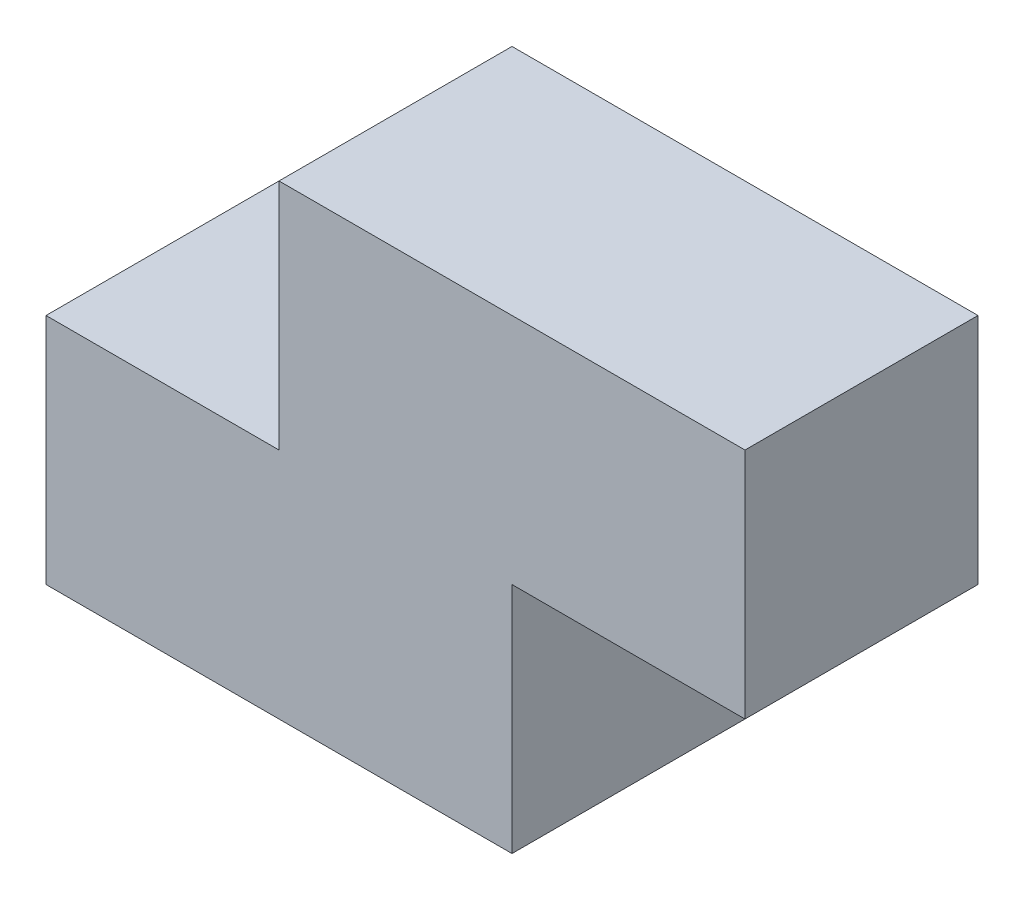
ISO-10303-21;
HEADER;
FILE_DESCRIPTION(('STEP AP214'),'2;1');
FILE_NAME('part.step','',(''),(''),'','','');
FILE_SCHEMA(('AUTOMOTIVE_DESIGN { 1 0 10303 214 1 1 1 1 }'));
ENDSEC;
DATA;
#1=APPLICATION_CONTEXT('core data for automotive mechanical design processes');
#2=APPLICATION_PROTOCOL_DEFINITION('international standard','automotive_design',2000,#1);
#3=PRODUCT_CONTEXT('',#1,'mechanical');
#4=PRODUCT('Part','Part','',(#3));
#5=PRODUCT_RELATED_PRODUCT_CATEGORY('part','',(#4));
#6=PRODUCT_DEFINITION_FORMATION('','',#4);
#7=PRODUCT_DEFINITION_CONTEXT('part definition',#1,'design');
#8=PRODUCT_DEFINITION('design','',#6,#7);
#9=PRODUCT_DEFINITION_SHAPE('','',#8);
#10=(LENGTH_UNIT() NAMED_UNIT(*) SI_UNIT(.MILLI.,.METRE.));
#11=(NAMED_UNIT(*) PLANE_ANGLE_UNIT() SI_UNIT($,.RADIAN.));
#12=(NAMED_UNIT(*) SI_UNIT($,.STERADIAN.) SOLID_ANGLE_UNIT());
#13=UNCERTAINTY_MEASURE_WITH_UNIT(LENGTH_MEASURE(1.E-05),#10,'distance_accuracy_value','');
#14=(GEOMETRIC_REPRESENTATION_CONTEXT(3) GLOBAL_UNCERTAINTY_ASSIGNED_CONTEXT((#13)) GLOBAL_UNIT_ASSIGNED_CONTEXT((#10,
#11,#12)) REPRESENTATION_CONTEXT('',''));
#15=CARTESIAN_POINT('',(0.,0.,0.));
#16=DIRECTION('',(0.,0.,1.));
#17=DIRECTION('',(1.,0.,0.));
#18=AXIS2_PLACEMENT_3D('',#15,#16,#17);
#19=CARTESIAN_POINT('',(1.11022302462516E-13,300.,300.));
#20=DIRECTION('',(1.,0.,0.));
#21=DIRECTION('',(0.,1.,0.));
#22=AXIS2_PLACEMENT_3D('',#19,#20,#21);
#23=PLANE('',#22);
#24=DIRECTION('',(0.,-1.,0.));
#25=VECTOR('',#24,1.);
#26=CARTESIAN_POINT('',(1.11022302462516E-13,300.,0.));
#27=LINE('',#26,#25);
#28=CARTESIAN_POINT('',(1.11022302462516E-13,300.,0.));
#29=VERTEX_POINT('',#28);
#30=CARTESIAN_POINT('',(0.,0.,0.));
#31=VERTEX_POINT('',#30);
#32=EDGE_CURVE('E140',#29,#31,#27,.T.);
#33=ORIENTED_EDGE('',*,*,#32,.T.);
#34=DIRECTION('',(0.,0.,-1.));
#35=VECTOR('',#34,1.);
#36=CARTESIAN_POINT('',(0.,0.,300.));
#37=LINE('',#36,#35);
#38=CARTESIAN_POINT('',(0.,0.,300.));
#39=VERTEX_POINT('',#38);
#40=EDGE_CURVE('E11',#39,#31,#37,.T.);
#41=ORIENTED_EDGE('',*,*,#40,.F.);
#42=DIRECTION('',(0.,-1.,0.));
#43=VECTOR('',#42,1.);
#44=CARTESIAN_POINT('',(1.11022302462516E-13,300.,300.));
#45=LINE('',#44,#43);
#46=CARTESIAN_POINT('',(1.11022302462516E-13,300.,300.));
#47=VERTEX_POINT('',#46);
#48=EDGE_CURVE('E162',#47,#39,#45,.T.);
#49=ORIENTED_EDGE('',*,*,#48,.F.);
#50=DIRECTION('',(0.,0.,-1.));
#51=VECTOR('',#50,1.);
#52=CARTESIAN_POINT('',(1.11022302462516E-13,300.,300.));
#53=LINE('',#52,#51);
#54=EDGE_CURVE('E136',#47,#29,#53,.T.);
#55=ORIENTED_EDGE('',*,*,#54,.T.);
#56=EDGE_LOOP('',(#33,#41,#49,#55));
#57=FACE_BOUND('',#56,.T.);
#58=ADVANCED_FACE('F39',(#57),#23,.F.);
#59=CARTESIAN_POINT('',(0.,0.,300.));
#60=DIRECTION('',(0.,1.,0.));
#61=DIRECTION('',(0.,0.,1.));
#62=AXIS2_PLACEMENT_3D('',#59,#60,#61);
#63=PLANE('',#62);
#64=DIRECTION('',(1.,0.,0.));
#65=VECTOR('',#64,1.);
#66=CARTESIAN_POINT('',(0.,0.,0.));
#67=LINE('',#66,#65);
#68=CARTESIAN_POINT('',(600.,0.,0.));
#69=VERTEX_POINT('',#68);
#70=EDGE_CURVE('E144',#31,#69,#67,.T.);
#71=ORIENTED_EDGE('',*,*,#70,.T.);
#72=DIRECTION('',(0.,0.,-1.));
#73=VECTOR('',#72,1.);
#74=CARTESIAN_POINT('',(600.,0.,300.));
#75=LINE('',#74,#73);
#76=CARTESIAN_POINT('',(600.,0.,300.));
#77=VERTEX_POINT('',#76);
#78=EDGE_CURVE('E48',#77,#69,#75,.T.);
#79=ORIENTED_EDGE('',*,*,#78,.F.);
#80=DIRECTION('',(1.,0.,0.));
#81=VECTOR('',#80,1.);
#82=CARTESIAN_POINT('',(0.,0.,300.));
#83=LINE('',#82,#81);
#84=EDGE_CURVE('E99',#39,#77,#83,.T.);
#85=ORIENTED_EDGE('',*,*,#84,.F.);
#86=ORIENTED_EDGE('',*,*,#40,.T.);
#87=EDGE_LOOP('',(#71,#79,#85,#86));
#88=FACE_BOUND('',#87,.T.);
#89=ADVANCED_FACE('F208',(#88),#63,.F.);
#90=CARTESIAN_POINT('',(600.,0.,300.));
#91=DIRECTION('',(-1.,0.,0.));
#92=DIRECTION('',(0.,0.,1.));
#93=AXIS2_PLACEMENT_3D('',#90,#91,#92);
#94=PLANE('',#93);
#95=DIRECTION('',(0.,1.,0.));
#96=VECTOR('',#95,1.);
#97=CARTESIAN_POINT('',(600.,0.,0.));
#98=LINE('',#97,#96);
#99=CARTESIAN_POINT('',(600.,300.,0.));
#100=VERTEX_POINT('',#99);
#101=EDGE_CURVE('E147',#69,#100,#98,.T.);
#102=ORIENTED_EDGE('',*,*,#101,.T.);
#103=DIRECTION('',(0.,0.,-1.));
#104=VECTOR('',#103,1.);
#105=CARTESIAN_POINT('',(600.,300.,300.));
#106=LINE('',#105,#104);
#107=CARTESIAN_POINT('',(600.,300.,300.));
#108=VERTEX_POINT('',#107);
#109=EDGE_CURVE('E173',#108,#100,#106,.T.);
#110=ORIENTED_EDGE('',*,*,#109,.F.);
#111=DIRECTION('',(0.,1.,0.));
#112=VECTOR('',#111,1.);
#113=CARTESIAN_POINT('',(600.,0.,300.));
#114=LINE('',#113,#112);
#115=EDGE_CURVE('E183',#77,#108,#114,.T.);
#116=ORIENTED_EDGE('',*,*,#115,.F.);
#117=ORIENTED_EDGE('',*,*,#78,.T.);
#118=EDGE_LOOP('',(#102,#110,#116,#117));
#119=FACE_BOUND('',#118,.T.);
#120=ADVANCED_FACE('F181',(#119),#94,.F.);
#121=CARTESIAN_POINT('',(600.,300.,300.));
#122=DIRECTION('',(0.,1.,0.));
#123=DIRECTION('',(0.,0.,1.));
#124=AXIS2_PLACEMENT_3D('',#121,#122,#123);
#125=PLANE('',#124);
#126=DIRECTION('',(1.,0.,0.));
#127=VECTOR('',#126,1.);
#128=CARTESIAN_POINT('',(600.,300.,0.));
#129=LINE('',#128,#127);
#130=CARTESIAN_POINT('',(900.,300.,0.));
#131=VERTEX_POINT('',#130);
#132=EDGE_CURVE('E150',#100,#131,#129,.T.);
#133=ORIENTED_EDGE('',*,*,#132,.T.);
#134=DIRECTION('',(0.,0.,-1.));
#135=VECTOR('',#134,1.);
#136=CARTESIAN_POINT('',(900.,300.,300.));
#137=LINE('',#136,#135);
#138=CARTESIAN_POINT('',(900.,300.,300.));
#139=VERTEX_POINT('',#138);
#140=EDGE_CURVE('E169',#139,#131,#137,.T.);
#141=ORIENTED_EDGE('',*,*,#140,.F.);
#142=DIRECTION('',(1.,0.,0.));
#143=VECTOR('',#142,1.);
#144=CARTESIAN_POINT('',(600.,300.,300.));
#145=LINE('',#144,#143);
#146=EDGE_CURVE('E196',#108,#139,#145,.T.);
#147=ORIENTED_EDGE('',*,*,#146,.F.);
#148=ORIENTED_EDGE('',*,*,#109,.T.);
#149=EDGE_LOOP('',(#133,#141,#147,#148));
#150=FACE_BOUND('',#149,.T.);
#151=ADVANCED_FACE('F191',(#150),#125,.F.);
#152=CARTESIAN_POINT('',(900.,300.,300.));
#153=DIRECTION('',(-1.,0.,0.));
#154=DIRECTION('',(0.,-1.,0.));
#155=AXIS2_PLACEMENT_3D('',#152,#153,#154);
#156=PLANE('',#155);
#157=DIRECTION('',(0.,1.,0.));
#158=VECTOR('',#157,1.);
#159=CARTESIAN_POINT('',(900.,300.,0.));
#160=LINE('',#159,#158);
#161=CARTESIAN_POINT('',(900.,600.,0.));
#162=VERTEX_POINT('',#161);
#163=EDGE_CURVE('E153',#131,#162,#160,.T.);
#164=ORIENTED_EDGE('',*,*,#163,.T.);
#165=DIRECTION('',(0.,0.,-1.));
#166=VECTOR('',#165,1.);
#167=CARTESIAN_POINT('',(900.,600.,300.));
#168=LINE('',#167,#166);
#169=CARTESIAN_POINT('',(900.,600.,300.));
#170=VERTEX_POINT('',#169);
#171=EDGE_CURVE('E129',#170,#162,#168,.T.);
#172=ORIENTED_EDGE('',*,*,#171,.F.);
#173=DIRECTION('',(0.,1.,0.));
#174=VECTOR('',#173,1.);
#175=CARTESIAN_POINT('',(900.,300.,300.));
#176=LINE('',#175,#174);
#177=EDGE_CURVE('E118',#139,#170,#176,.T.);
#178=ORIENTED_EDGE('',*,*,#177,.F.);
#179=ORIENTED_EDGE('',*,*,#140,.T.);
#180=EDGE_LOOP('',(#164,#172,#178,#179));
#181=FACE_BOUND('',#180,.T.);
#182=ADVANCED_FACE('F194',(#181),#156,.F.);
#183=CARTESIAN_POINT('',(900.,600.,300.));
#184=DIRECTION('',(0.,-1.,0.));
#185=DIRECTION('',(1.,0.,0.));
#186=AXIS2_PLACEMENT_3D('',#183,#184,#185);
#187=PLANE('',#186);
#188=DIRECTION('',(-1.,0.,0.));
#189=VECTOR('',#188,1.);
#190=CARTESIAN_POINT('',(900.,600.,0.));
#191=LINE('',#190,#189);
#192=CARTESIAN_POINT('',(300.,600.,0.));
#193=VERTEX_POINT('',#192);
#194=EDGE_CURVE('E127',#162,#193,#191,.T.);
#195=ORIENTED_EDGE('',*,*,#194,.T.);
#196=DIRECTION('',(0.,0.,-1.));
#197=VECTOR('',#196,1.);
#198=CARTESIAN_POINT('',(300.,600.,300.));
#199=LINE('',#198,#197);
#200=CARTESIAN_POINT('',(300.,600.,300.));
#201=VERTEX_POINT('',#200);
#202=EDGE_CURVE('E124',#201,#193,#199,.T.);
#203=ORIENTED_EDGE('',*,*,#202,.F.);
#204=DIRECTION('',(-1.,0.,0.));
#205=VECTOR('',#204,1.);
#206=CARTESIAN_POINT('',(900.,600.,300.));
#207=LINE('',#206,#205);
#208=EDGE_CURVE('E112',#170,#201,#207,.T.);
#209=ORIENTED_EDGE('',*,*,#208,.F.);
#210=ORIENTED_EDGE('',*,*,#171,.T.);
#211=EDGE_LOOP('',(#195,#203,#209,#210));
#212=FACE_BOUND('',#211,.T.);
#213=ADVANCED_FACE('F125',(#212),#187,.F.);
#214=CARTESIAN_POINT('',(300.,600.,300.));
#215=DIRECTION('',(1.,0.,0.));
#216=DIRECTION('',(0.,1.,0.));
#217=AXIS2_PLACEMENT_3D('',#214,#215,#216);
#218=PLANE('',#217);
#219=DIRECTION('',(0.,-1.,0.));
#220=VECTOR('',#219,1.);
#221=CARTESIAN_POINT('',(300.,600.,0.));
#222=LINE('',#221,#220);
#223=CARTESIAN_POINT('',(300.,300.,0.));
#224=VERTEX_POINT('',#223);
#225=EDGE_CURVE('E85',#193,#224,#222,.T.);
#226=ORIENTED_EDGE('',*,*,#225,.T.);
#227=DIRECTION('',(0.,0.,-1.));
#228=VECTOR('',#227,1.);
#229=CARTESIAN_POINT('',(300.,300.,300.));
#230=LINE('',#229,#228);
#231=CARTESIAN_POINT('',(300.,300.,300.));
#232=VERTEX_POINT('',#231);
#233=EDGE_CURVE('E130',#232,#224,#230,.T.);
#234=ORIENTED_EDGE('',*,*,#233,.F.);
#235=DIRECTION('',(0.,-1.,0.));
#236=VECTOR('',#235,1.);
#237=CARTESIAN_POINT('',(300.,600.,300.));
#238=LINE('',#237,#236);
#239=EDGE_CURVE('E116',#201,#232,#238,.T.);
#240=ORIENTED_EDGE('',*,*,#239,.F.);
#241=ORIENTED_EDGE('',*,*,#202,.T.);
#242=EDGE_LOOP('',(#226,#234,#240,#241));
#243=FACE_BOUND('',#242,.T.);
#244=ADVANCED_FACE('F132',(#243),#218,.F.);
#245=CARTESIAN_POINT('',(300.,300.,300.));
#246=DIRECTION('',(0.,-1.,0.));
#247=DIRECTION('',(0.,0.,-1.));
#248=AXIS2_PLACEMENT_3D('',#245,#246,#247);
#249=PLANE('',#248);
#250=DIRECTION('',(-1.,0.,0.));
#251=VECTOR('',#250,1.);
#252=CARTESIAN_POINT('',(300.,300.,0.));
#253=LINE('',#252,#251);
#254=EDGE_CURVE('E91',#224,#29,#253,.T.);
#255=ORIENTED_EDGE('',*,*,#254,.T.);
#256=ORIENTED_EDGE('',*,*,#54,.F.);
#257=DIRECTION('',(-1.,0.,0.));
#258=VECTOR('',#257,1.);
#259=CARTESIAN_POINT('',(300.,300.,300.));
#260=LINE('',#259,#258);
#261=EDGE_CURVE('E56',#232,#47,#260,.T.);
#262=ORIENTED_EDGE('',*,*,#261,.F.);
#263=ORIENTED_EDGE('',*,*,#233,.T.);
#264=EDGE_LOOP('',(#255,#256,#262,#263));
#265=FACE_BOUND('',#264,.T.);
#266=ADVANCED_FACE('F224',(#265),#249,.F.);
#267=CARTESIAN_POINT('',(0.,0.,300.));
#268=DIRECTION('',(0.,0.,1.));
#269=DIRECTION('',(1.,0.,0.));
#270=AXIS2_PLACEMENT_3D('',#267,#268,#269);
#271=PLANE('',#270);
#272=ORIENTED_EDGE('',*,*,#48,.T.);
#273=ORIENTED_EDGE('',*,*,#84,.T.);
#274=ORIENTED_EDGE('',*,*,#115,.T.);
#275=ORIENTED_EDGE('',*,*,#146,.T.);
#276=ORIENTED_EDGE('',*,*,#177,.T.);
#277=ORIENTED_EDGE('',*,*,#208,.T.);
#278=ORIENTED_EDGE('',*,*,#239,.T.);
#279=ORIENTED_EDGE('',*,*,#261,.T.);
#280=EDGE_LOOP('',(#272,#273,#274,#275,#276,#277,#278,#279));
#281=FACE_BOUND('',#280,.T.);
#282=ADVANCED_FACE('F114',(#281),#271,.T.);
#283=CARTESIAN_POINT('',(0.,0.,0.));
#284=DIRECTION('',(0.,0.,1.));
#285=DIRECTION('',(1.,0.,0.));
#286=AXIS2_PLACEMENT_3D('',#283,#284,#285);
#287=PLANE('',#286);
#288=ORIENTED_EDGE('',*,*,#32,.F.);
#289=ORIENTED_EDGE('',*,*,#254,.F.);
#290=ORIENTED_EDGE('',*,*,#225,.F.);
#291=ORIENTED_EDGE('',*,*,#194,.F.);
#292=ORIENTED_EDGE('',*,*,#163,.F.);
#293=ORIENTED_EDGE('',*,*,#132,.F.);
#294=ORIENTED_EDGE('',*,*,#101,.F.);
#295=ORIENTED_EDGE('',*,*,#70,.F.);
#296=EDGE_LOOP('',(#288,#289,#290,#291,#292,#293,#294,#295));
#297=FACE_BOUND('',#296,.T.);
#298=ADVANCED_FACE('F187',(#297),#287,.F.);
#299=CLOSED_SHELL('',(#58,#89,#120,#151,#182,#213,#244,#266,#282,#298));
#300=MANIFOLD_SOLID_BREP('B2',#299);
#301=ADVANCED_BREP_SHAPE_REPRESENTATION('',(#18,#300),#14);
#302=SHAPE_DEFINITION_REPRESENTATION(#9,#301);
ENDSEC;
END-ISO-10303-21;
